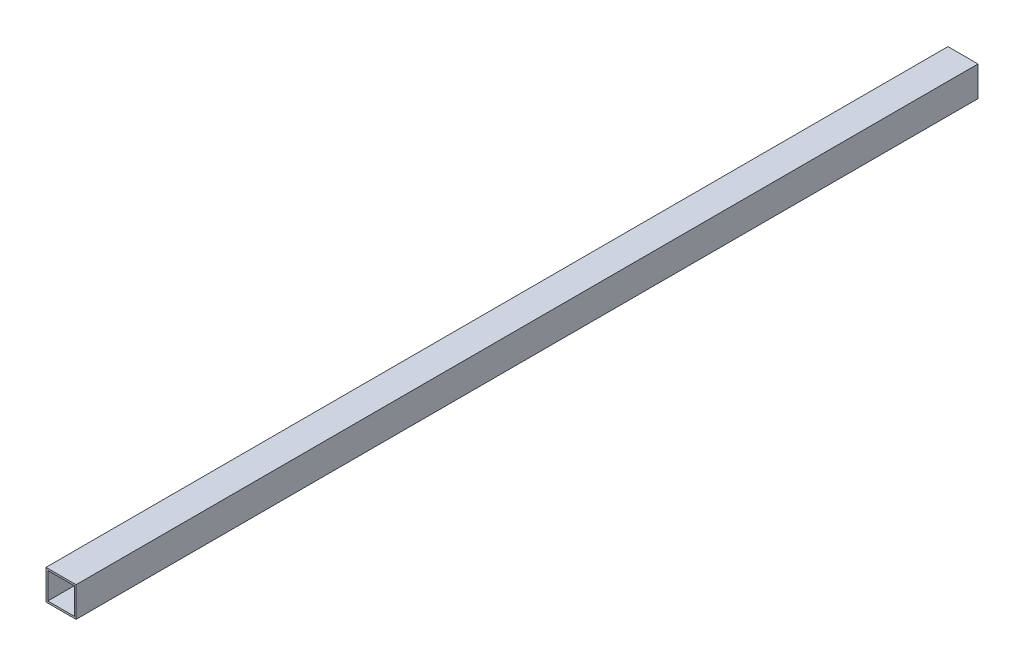
ISO-10303-21;
HEADER;
FILE_DESCRIPTION(('STEP AP214'),'2;1');
FILE_NAME('part.step','',(''),(''),'','','');
FILE_SCHEMA(('AUTOMOTIVE_DESIGN { 1 0 10303 214 1 1 1 1 }'));
ENDSEC;
DATA;
#1=APPLICATION_CONTEXT('core data for automotive mechanical design processes');
#2=APPLICATION_PROTOCOL_DEFINITION('international standard','automotive_design',2000,#1);
#3=PRODUCT_CONTEXT('',#1,'mechanical');
#4=PRODUCT('Part','Part','',(#3));
#5=PRODUCT_RELATED_PRODUCT_CATEGORY('part','',(#4));
#6=PRODUCT_DEFINITION_FORMATION('','',#4);
#7=PRODUCT_DEFINITION_CONTEXT('part definition',#1,'design');
#8=PRODUCT_DEFINITION('design','',#6,#7);
#9=PRODUCT_DEFINITION_SHAPE('','',#8);
#10=(LENGTH_UNIT() NAMED_UNIT(*) SI_UNIT(.MILLI.,.METRE.));
#11=(NAMED_UNIT(*) PLANE_ANGLE_UNIT() SI_UNIT($,.RADIAN.));
#12=(NAMED_UNIT(*) SI_UNIT($,.STERADIAN.) SOLID_ANGLE_UNIT());
#13=UNCERTAINTY_MEASURE_WITH_UNIT(LENGTH_MEASURE(1.E-05),#10,'distance_accuracy_value','');
#14=(GEOMETRIC_REPRESENTATION_CONTEXT(3) GLOBAL_UNCERTAINTY_ASSIGNED_CONTEXT((#13)) GLOBAL_UNIT_ASSIGNED_CONTEXT((#10,
#11,#12)) REPRESENTATION_CONTEXT('',''));
#15=CARTESIAN_POINT('',(0.,0.,0.));
#16=DIRECTION('',(0.,0.,1.));
#17=DIRECTION('',(1.,0.,0.));
#18=AXIS2_PLACEMENT_3D('',#15,#16,#17);
#19=CARTESIAN_POINT('',(0.,0.,750.));
#20=DIRECTION('',(0.,0.,-1.));
#21=DIRECTION('',(-1.,0.,0.));
#22=AXIS2_PLACEMENT_3D('',#19,#20,#21);
#23=PLANE('',#22);
#24=DIRECTION('',(0.,1.,0.));
#25=VECTOR('',#24,1.);
#26=CARTESIAN_POINT('',(25.,-25.,750.));
#27=LINE('',#26,#25);
#28=CARTESIAN_POINT('',(25.,-25.,750.));
#29=VERTEX_POINT('',#28);
#30=CARTESIAN_POINT('',(25.,25.,750.));
#31=VERTEX_POINT('',#30);
#32=EDGE_CURVE('E153',#29,#31,#27,.T.);
#33=ORIENTED_EDGE('',*,*,#32,.T.);
#34=DIRECTION('',(-1.,0.,0.));
#35=VECTOR('',#34,1.);
#36=CARTESIAN_POINT('',(-25.,25.,750.));
#37=LINE('',#36,#35);
#38=CARTESIAN_POINT('',(-25.,25.,750.));
#39=VERTEX_POINT('',#38);
#40=EDGE_CURVE('E157',#31,#39,#37,.T.);
#41=ORIENTED_EDGE('',*,*,#40,.T.);
#42=DIRECTION('',(0.,-1.,0.));
#43=VECTOR('',#42,1.);
#44=CARTESIAN_POINT('',(-25.,-25.,750.));
#45=LINE('',#44,#43);
#46=CARTESIAN_POINT('',(-25.,-25.,750.));
#47=VERTEX_POINT('',#46);
#48=EDGE_CURVE('E161',#39,#47,#45,.T.);
#49=ORIENTED_EDGE('',*,*,#48,.T.);
#50=DIRECTION('',(1.,0.,0.));
#51=VECTOR('',#50,1.);
#52=CARTESIAN_POINT('',(-25.,-25.,750.));
#53=LINE('',#52,#51);
#54=EDGE_CURVE('E164',#47,#29,#53,.T.);
#55=ORIENTED_EDGE('',*,*,#54,.T.);
#56=EDGE_LOOP('',(#33,#41,#49,#55));
#57=FACE_BOUND('',#56,.T.);
#58=DIRECTION('',(1.,0.,0.));
#59=VECTOR('',#58,1.);
#60=CARTESIAN_POINT('',(-22.,-22.,750.));
#61=LINE('',#60,#59);
#62=CARTESIAN_POINT('',(-22.,-22.,750.));
#63=VERTEX_POINT('',#62);
#64=CARTESIAN_POINT('',(22.,-22.,750.));
#65=VERTEX_POINT('',#64);
#66=EDGE_CURVE('E105',#63,#65,#61,.T.);
#67=ORIENTED_EDGE('',*,*,#66,.F.);
#68=DIRECTION('',(0.,-1.,0.));
#69=VECTOR('',#68,1.);
#70=CARTESIAN_POINT('',(-22.,-22.,750.));
#71=LINE('',#70,#69);
#72=CARTESIAN_POINT('',(-22.,22.,750.));
#73=VERTEX_POINT('',#72);
#74=EDGE_CURVE('E131',#73,#63,#71,.T.);
#75=ORIENTED_EDGE('',*,*,#74,.F.);
#76=DIRECTION('',(-1.,0.,0.));
#77=VECTOR('',#76,1.);
#78=CARTESIAN_POINT('',(-22.,22.,750.));
#79=LINE('',#78,#77);
#80=CARTESIAN_POINT('',(22.,22.,750.));
#81=VERTEX_POINT('',#80);
#82=EDGE_CURVE('E127',#81,#73,#79,.T.);
#83=ORIENTED_EDGE('',*,*,#82,.F.);
#84=DIRECTION('',(0.,1.,0.));
#85=VECTOR('',#84,1.);
#86=CARTESIAN_POINT('',(22.,-22.,750.));
#87=LINE('',#86,#85);
#88=EDGE_CURVE('E114',#65,#81,#87,.T.);
#89=ORIENTED_EDGE('',*,*,#88,.F.);
#90=EDGE_LOOP('',(#67,#75,#83,#89));
#91=FACE_BOUND('',#90,.T.);
#92=ADVANCED_FACE('F39',(#57,#91),#23,.F.);
#93=CARTESIAN_POINT('',(0.,0.,-750.));
#94=DIRECTION('',(0.,0.,-1.));
#95=DIRECTION('',(-1.,0.,0.));
#96=AXIS2_PLACEMENT_3D('',#93,#94,#95);
#97=PLANE('',#96);
#98=DIRECTION('',(0.,1.,0.));
#99=VECTOR('',#98,1.);
#100=CARTESIAN_POINT('',(25.,-25.,-750.));
#101=LINE('',#100,#99);
#102=CARTESIAN_POINT('',(25.,-25.,-750.));
#103=VERTEX_POINT('',#102);
#104=CARTESIAN_POINT('',(25.,25.,-750.));
#105=VERTEX_POINT('',#104);
#106=EDGE_CURVE('E123',#103,#105,#101,.T.);
#107=ORIENTED_EDGE('',*,*,#106,.F.);
#108=DIRECTION('',(1.,0.,0.));
#109=VECTOR('',#108,1.);
#110=CARTESIAN_POINT('',(-25.,-25.,-750.));
#111=LINE('',#110,#109);
#112=CARTESIAN_POINT('',(-25.,-25.,-750.));
#113=VERTEX_POINT('',#112);
#114=EDGE_CURVE('E158',#113,#103,#111,.T.);
#115=ORIENTED_EDGE('',*,*,#114,.F.);
#116=DIRECTION('',(0.,-1.,0.));
#117=VECTOR('',#116,1.);
#118=CARTESIAN_POINT('',(-25.,-25.,-750.));
#119=LINE('',#118,#117);
#120=CARTESIAN_POINT('',(-25.,25.,-750.));
#121=VERTEX_POINT('',#120);
#122=EDGE_CURVE('E174',#121,#113,#119,.T.);
#123=ORIENTED_EDGE('',*,*,#122,.F.);
#124=DIRECTION('',(-1.,0.,0.));
#125=VECTOR('',#124,1.);
#126=CARTESIAN_POINT('',(-25.,25.,-750.));
#127=LINE('',#126,#125);
#128=EDGE_CURVE('E171',#105,#121,#127,.T.);
#129=ORIENTED_EDGE('',*,*,#128,.F.);
#130=EDGE_LOOP('',(#107,#115,#123,#129));
#131=FACE_BOUND('',#130,.T.);
#132=DIRECTION('',(0.,-1.,0.));
#133=VECTOR('',#132,1.);
#134=CARTESIAN_POINT('',(-22.,-22.,-750.));
#135=LINE('',#134,#133);
#136=CARTESIAN_POINT('',(-22.,22.,-750.));
#137=VERTEX_POINT('',#136);
#138=CARTESIAN_POINT('',(-22.,-22.,-750.));
#139=VERTEX_POINT('',#138);
#140=EDGE_CURVE('E115',#137,#139,#135,.T.);
#141=ORIENTED_EDGE('',*,*,#140,.T.);
#142=DIRECTION('',(1.,0.,0.));
#143=VECTOR('',#142,1.);
#144=CARTESIAN_POINT('',(-22.,-22.,-750.));
#145=LINE('',#144,#143);
#146=CARTESIAN_POINT('',(22.,-22.,-750.));
#147=VERTEX_POINT('',#146);
#148=EDGE_CURVE('E63',#139,#147,#145,.T.);
#149=ORIENTED_EDGE('',*,*,#148,.T.);
#150=DIRECTION('',(0.,1.,0.));
#151=VECTOR('',#150,1.);
#152=CARTESIAN_POINT('',(22.,-22.,-750.));
#153=LINE('',#152,#151);
#154=CARTESIAN_POINT('',(22.,22.,-750.));
#155=VERTEX_POINT('',#154);
#156=EDGE_CURVE('E121',#147,#155,#153,.T.);
#157=ORIENTED_EDGE('',*,*,#156,.T.);
#158=DIRECTION('',(-1.,0.,0.));
#159=VECTOR('',#158,1.);
#160=CARTESIAN_POINT('',(-22.,22.,-750.));
#161=LINE('',#160,#159);
#162=EDGE_CURVE('E140',#155,#137,#161,.T.);
#163=ORIENTED_EDGE('',*,*,#162,.T.);
#164=EDGE_LOOP('',(#141,#149,#157,#163));
#165=FACE_BOUND('',#164,.T.);
#166=ADVANCED_FACE('F197',(#131,#165),#97,.T.);
#167=CARTESIAN_POINT('',(25.,-25.,750.));
#168=DIRECTION('',(-1.,0.,0.));
#169=DIRECTION('',(0.,0.,1.));
#170=AXIS2_PLACEMENT_3D('',#167,#168,#169);
#171=PLANE('',#170);
#172=ORIENTED_EDGE('',*,*,#106,.T.);
#173=DIRECTION('',(0.,0.,-1.));
#174=VECTOR('',#173,1.);
#175=CARTESIAN_POINT('',(25.,25.,750.));
#176=LINE('',#175,#174);
#177=EDGE_CURVE('E11',#31,#105,#176,.T.);
#178=ORIENTED_EDGE('',*,*,#177,.F.);
#179=ORIENTED_EDGE('',*,*,#32,.F.);
#180=DIRECTION('',(0.,0.,-1.));
#181=VECTOR('',#180,1.);
#182=CARTESIAN_POINT('',(25.,-25.,750.));
#183=LINE('',#182,#181);
#184=EDGE_CURVE('E167',#29,#103,#183,.T.);
#185=ORIENTED_EDGE('',*,*,#184,.T.);
#186=EDGE_LOOP('',(#172,#178,#179,#185));
#187=FACE_BOUND('',#186,.T.);
#188=ADVANCED_FACE('F41',(#187),#171,.F.);
#189=CARTESIAN_POINT('',(-25.,25.,750.));
#190=DIRECTION('',(0.,-1.,0.));
#191=DIRECTION('',(0.,0.,-1.));
#192=AXIS2_PLACEMENT_3D('',#189,#190,#191);
#193=PLANE('',#192);
#194=ORIENTED_EDGE('',*,*,#128,.T.);
#195=DIRECTION('',(0.,0.,-1.));
#196=VECTOR('',#195,1.);
#197=CARTESIAN_POINT('',(-25.,25.,750.));
#198=LINE('',#197,#196);
#199=EDGE_CURVE('E48',#39,#121,#198,.T.);
#200=ORIENTED_EDGE('',*,*,#199,.F.);
#201=ORIENTED_EDGE('',*,*,#40,.F.);
#202=ORIENTED_EDGE('',*,*,#177,.T.);
#203=EDGE_LOOP('',(#194,#200,#201,#202));
#204=FACE_BOUND('',#203,.T.);
#205=ADVANCED_FACE('F207',(#204),#193,.F.);
#206=CARTESIAN_POINT('',(-25.,-25.,750.));
#207=DIRECTION('',(1.,0.,0.));
#208=DIRECTION('',(0.,0.,-1.));
#209=AXIS2_PLACEMENT_3D('',#206,#207,#208);
#210=PLANE('',#209);
#211=ORIENTED_EDGE('',*,*,#122,.T.);
#212=DIRECTION('',(0.,0.,-1.));
#213=VECTOR('',#212,1.);
#214=CARTESIAN_POINT('',(-25.,-25.,750.));
#215=LINE('',#214,#213);
#216=EDGE_CURVE('E182',#47,#113,#215,.T.);
#217=ORIENTED_EDGE('',*,*,#216,.F.);
#218=ORIENTED_EDGE('',*,*,#48,.F.);
#219=ORIENTED_EDGE('',*,*,#199,.T.);
#220=EDGE_LOOP('',(#211,#217,#218,#219));
#221=FACE_BOUND('',#220,.T.);
#222=ADVANCED_FACE('F191',(#221),#210,.F.);
#223=CARTESIAN_POINT('',(-25.,-25.,750.));
#224=DIRECTION('',(0.,1.,0.));
#225=DIRECTION('',(0.,0.,1.));
#226=AXIS2_PLACEMENT_3D('',#223,#224,#225);
#227=PLANE('',#226);
#228=ORIENTED_EDGE('',*,*,#114,.T.);
#229=ORIENTED_EDGE('',*,*,#184,.F.);
#230=ORIENTED_EDGE('',*,*,#54,.F.);
#231=ORIENTED_EDGE('',*,*,#216,.T.);
#232=EDGE_LOOP('',(#228,#229,#230,#231));
#233=FACE_BOUND('',#232,.T.);
#234=ADVANCED_FACE('F201',(#233),#227,.F.);
#235=CARTESIAN_POINT('',(-22.,-22.,750.));
#236=DIRECTION('',(0.,1.,0.));
#237=DIRECTION('',(0.,0.,1.));
#238=AXIS2_PLACEMENT_3D('',#235,#236,#237);
#239=PLANE('',#238);
#240=ORIENTED_EDGE('',*,*,#148,.F.);
#241=DIRECTION('',(0.,0.,-1.));
#242=VECTOR('',#241,1.);
#243=CARTESIAN_POINT('',(-22.,-22.,750.));
#244=LINE('',#243,#242);
#245=EDGE_CURVE('E109',#63,#139,#244,.T.);
#246=ORIENTED_EDGE('',*,*,#245,.F.);
#247=ORIENTED_EDGE('',*,*,#66,.T.);
#248=DIRECTION('',(0.,0.,-1.));
#249=VECTOR('',#248,1.);
#250=CARTESIAN_POINT('',(22.,-22.,750.));
#251=LINE('',#250,#249);
#252=EDGE_CURVE('E108',#65,#147,#251,.T.);
#253=ORIENTED_EDGE('',*,*,#252,.T.);
#254=EDGE_LOOP('',(#240,#246,#247,#253));
#255=FACE_BOUND('',#254,.T.);
#256=ADVANCED_FACE('F107',(#255),#239,.T.);
#257=CARTESIAN_POINT('',(22.,-22.,750.));
#258=DIRECTION('',(-1.,0.,0.));
#259=DIRECTION('',(0.,0.,1.));
#260=AXIS2_PLACEMENT_3D('',#257,#258,#259);
#261=PLANE('',#260);
#262=ORIENTED_EDGE('',*,*,#156,.F.);
#263=ORIENTED_EDGE('',*,*,#252,.F.);
#264=ORIENTED_EDGE('',*,*,#88,.T.);
#265=DIRECTION('',(0.,0.,-1.));
#266=VECTOR('',#265,1.);
#267=CARTESIAN_POINT('',(22.,22.,750.));
#268=LINE('',#267,#266);
#269=EDGE_CURVE('E124',#81,#155,#268,.T.);
#270=ORIENTED_EDGE('',*,*,#269,.T.);
#271=EDGE_LOOP('',(#262,#263,#264,#270));
#272=FACE_BOUND('',#271,.T.);
#273=ADVANCED_FACE('F118',(#272),#261,.T.);
#274=CARTESIAN_POINT('',(-22.,22.,750.));
#275=DIRECTION('',(0.,-1.,0.));
#276=DIRECTION('',(1.,0.,0.));
#277=AXIS2_PLACEMENT_3D('',#274,#275,#276);
#278=PLANE('',#277);
#279=ORIENTED_EDGE('',*,*,#162,.F.);
#280=ORIENTED_EDGE('',*,*,#269,.F.);
#281=ORIENTED_EDGE('',*,*,#82,.T.);
#282=DIRECTION('',(0.,0.,-1.));
#283=VECTOR('',#282,1.);
#284=CARTESIAN_POINT('',(-22.,22.,750.));
#285=LINE('',#284,#283);
#286=EDGE_CURVE('E55',#73,#137,#285,.T.);
#287=ORIENTED_EDGE('',*,*,#286,.T.);
#288=EDGE_LOOP('',(#279,#280,#281,#287));
#289=FACE_BOUND('',#288,.T.);
#290=ADVANCED_FACE('F230',(#289),#278,.T.);
#291=CARTESIAN_POINT('',(-22.,-22.,750.));
#292=DIRECTION('',(1.,0.,0.));
#293=DIRECTION('',(0.,0.,-1.));
#294=AXIS2_PLACEMENT_3D('',#291,#292,#293);
#295=PLANE('',#294);
#296=ORIENTED_EDGE('',*,*,#140,.F.);
#297=ORIENTED_EDGE('',*,*,#286,.F.);
#298=ORIENTED_EDGE('',*,*,#74,.T.);
#299=ORIENTED_EDGE('',*,*,#245,.T.);
#300=EDGE_LOOP('',(#296,#297,#298,#299));
#301=FACE_BOUND('',#300,.T.);
#302=ADVANCED_FACE('F234',(#301),#295,.T.);
#303=CLOSED_SHELL('',(#92,#166,#188,#205,#222,#234,#256,#273,#290,#302));
#304=MANIFOLD_SOLID_BREP('B2',#303);
#305=ADVANCED_BREP_SHAPE_REPRESENTATION('',(#18,#304),#14);
#306=SHAPE_DEFINITION_REPRESENTATION(#9,#305);
ENDSEC;
END-ISO-10303-21;
